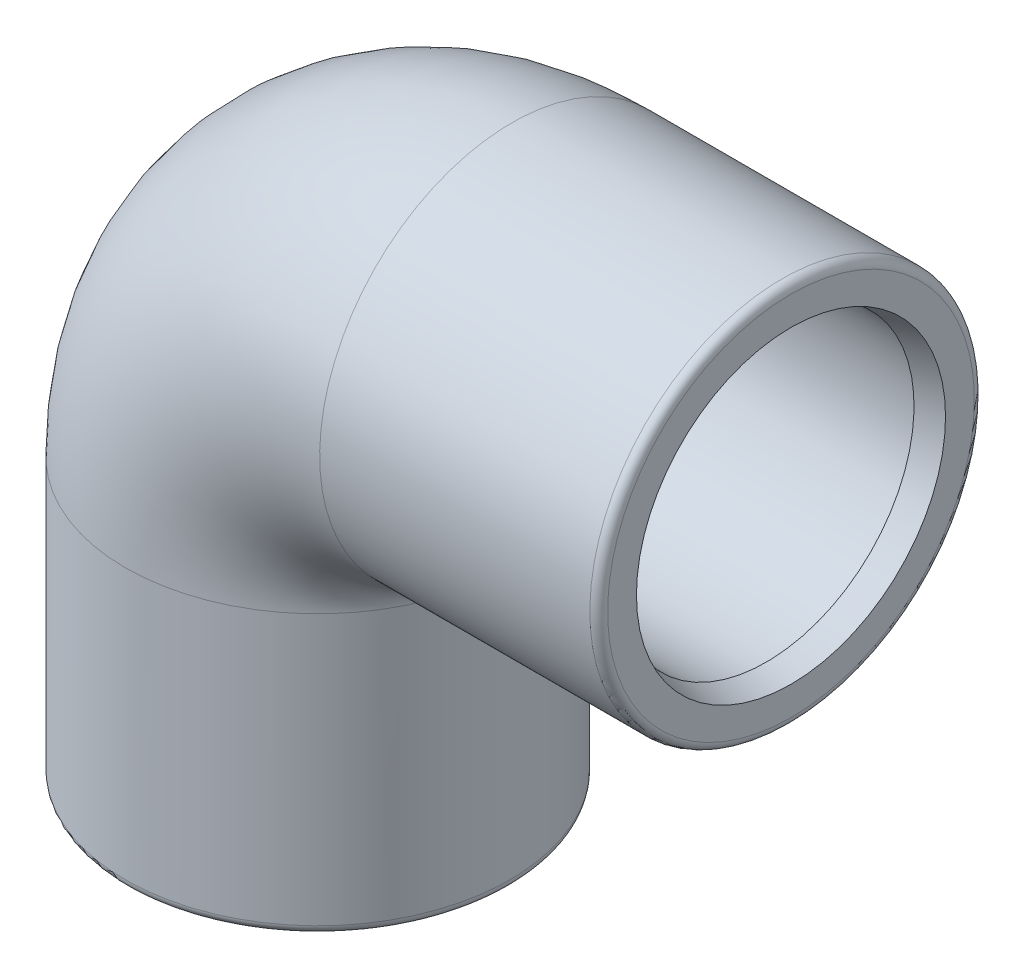
ISO-10303-21;
HEADER;
FILE_DESCRIPTION(('STEP AP214'),'2;1');
FILE_NAME('part.step','',(''),(''),'','','');
FILE_SCHEMA(('AUTOMOTIVE_DESIGN { 1 0 10303 214 1 1 1 1 }'));
ENDSEC;
DATA;
#1=APPLICATION_CONTEXT('core data for automotive mechanical design processes');
#2=APPLICATION_PROTOCOL_DEFINITION('international standard','automotive_design',2000,#1);
#3=PRODUCT_CONTEXT('',#1,'mechanical');
#4=PRODUCT('Part','Part','',(#3));
#5=PRODUCT_RELATED_PRODUCT_CATEGORY('part','',(#4));
#6=PRODUCT_DEFINITION_FORMATION('','',#4);
#7=PRODUCT_DEFINITION_CONTEXT('part definition',#1,'design');
#8=PRODUCT_DEFINITION('design','',#6,#7);
#9=PRODUCT_DEFINITION_SHAPE('','',#8);
#10=(LENGTH_UNIT() NAMED_UNIT(*) SI_UNIT(.MILLI.,.METRE.));
#11=(NAMED_UNIT(*) PLANE_ANGLE_UNIT() SI_UNIT($,.RADIAN.));
#12=(NAMED_UNIT(*) SI_UNIT($,.STERADIAN.) SOLID_ANGLE_UNIT());
#13=UNCERTAINTY_MEASURE_WITH_UNIT(LENGTH_MEASURE(1.E-05),#10,'distance_accuracy_value','');
#14=(GEOMETRIC_REPRESENTATION_CONTEXT(3) GLOBAL_UNCERTAINTY_ASSIGNED_CONTEXT((#13)) GLOBAL_UNIT_ASSIGNED_CONTEXT((#10,
#11,#12)) REPRESENTATION_CONTEXT('',''));
#15=CARTESIAN_POINT('',(0.,0.,0.));
#16=DIRECTION('',(0.,0.,1.));
#17=DIRECTION('',(1.,0.,0.));
#18=AXIS2_PLACEMENT_3D('',#15,#16,#17);
#19=CARTESIAN_POINT('',(0.,0.,0.));
#20=DIRECTION('',(0.,0.,-1.));
#21=DIRECTION('',(-1.,0.,0.));
#22=AXIS2_PLACEMENT_3D('',#19,#20,#21);
#23=TOROIDAL_SURFACE('',#22,13.13,13.);
#24=CARTESIAN_POINT('',(-13.13,0.,0.));
#25=DIRECTION('',(0.,1.,0.));
#26=DIRECTION('',(-1.,0.,0.));
#27=AXIS2_PLACEMENT_3D('',#24,#25,#26);
#28=CIRCLE('',#27,13.);
#29=CARTESIAN_POINT('',(-0.13,0.,0.));
#30=VERTEX_POINT('',#29);
#31=EDGE_CURVE('E79',#30,#30,#28,.T.);
#32=ORIENTED_EDGE('',*,*,#31,.T.);
#33=EDGE_LOOP('',(#32));
#34=FACE_BOUND('',#33,.T.);
#35=CARTESIAN_POINT('',(0.,13.13,0.));
#36=DIRECTION('',(-1.,0.,0.));
#37=DIRECTION('',(0.,1.,0.));
#38=AXIS2_PLACEMENT_3D('',#35,#36,#37);
#39=CIRCLE('',#38,13.);
#40=CARTESIAN_POINT('',(0.,0.13,0.));
#41=VERTEX_POINT('',#40);
#42=EDGE_CURVE('E11',#41,#41,#39,.T.);
#43=ORIENTED_EDGE('',*,*,#42,.T.);
#44=EDGE_LOOP('',(#43));
#45=FACE_BOUND('',#44,.T.);
#46=ADVANCED_FACE('F16',(#34,#45),#23,.T.);
#47=CARTESIAN_POINT('',(10.5,13.13,0.));
#48=DIRECTION('',(1.,0.,0.));
#49=DIRECTION('',(0.,0.,1.));
#50=AXIS2_PLACEMENT_3D('',#47,#48,#49);
#51=CYLINDRICAL_SURFACE('',#50,13.);
#52=ORIENTED_EDGE('',*,*,#42,.F.);
#53=EDGE_LOOP('',(#52));
#54=FACE_BOUND('',#53,.T.);
#55=CARTESIAN_POINT('',(18.27,13.13,0.));
#56=DIRECTION('',(-1.,0.,0.));
#57=DIRECTION('',(0.,0.,1.));
#58=AXIS2_PLACEMENT_3D('',#55,#56,#57);
#59=CIRCLE('',#58,13.);
#60=CARTESIAN_POINT('',(18.27,0.13,0.));
#61=VERTEX_POINT('',#60);
#62=EDGE_CURVE('E69',#61,#61,#59,.T.);
#63=ORIENTED_EDGE('',*,*,#62,.T.);
#64=EDGE_LOOP('',(#63));
#65=FACE_BOUND('',#64,.T.);
#66=ADVANCED_FACE('F107',(#54,#65),#51,.T.);
#67=CARTESIAN_POINT('',(0.,0.,0.));
#68=DIRECTION('',(0.,0.,-1.));
#69=DIRECTION('',(-1.,0.,0.));
#70=AXIS2_PLACEMENT_3D('',#67,#68,#69);
#71=TOROIDAL_SURFACE('',#70,13.13,9.);
#72=CARTESIAN_POINT('',(-13.13,0.,0.));
#73=DIRECTION('',(0.,1.,0.));
#74=DIRECTION('',(-1.,0.,0.));
#75=AXIS2_PLACEMENT_3D('',#72,#73,#74);
#76=CIRCLE('',#75,9.);
#77=CARTESIAN_POINT('',(-4.13,0.,0.));
#78=VERTEX_POINT('',#77);
#79=EDGE_CURVE('E87',#78,#78,#76,.T.);
#80=ORIENTED_EDGE('',*,*,#79,.F.);
#81=EDGE_LOOP('',(#80));
#82=FACE_BOUND('',#81,.T.);
#83=CARTESIAN_POINT('',(0.,13.13,0.));
#84=DIRECTION('',(-1.,0.,0.));
#85=DIRECTION('',(0.,1.,0.));
#86=AXIS2_PLACEMENT_3D('',#83,#84,#85);
#87=CIRCLE('',#86,9.);
#88=CARTESIAN_POINT('',(0.,4.13,0.));
#89=VERTEX_POINT('',#88);
#90=EDGE_CURVE('E26',#89,#89,#87,.T.);
#91=ORIENTED_EDGE('',*,*,#90,.F.);
#92=EDGE_LOOP('',(#91));
#93=FACE_BOUND('',#92,.T.);
#94=ADVANCED_FACE('F109',(#82,#93),#71,.F.);
#95=CARTESIAN_POINT('',(10.5,13.13,0.));
#96=DIRECTION('',(1.,0.,0.));
#97=DIRECTION('',(0.,0.,1.));
#98=AXIS2_PLACEMENT_3D('',#95,#96,#97);
#99=CYLINDRICAL_SURFACE('',#98,10.);
#100=CARTESIAN_POINT('',(0.,13.13,0.));
#101=DIRECTION('',(-1.,0.,0.));
#102=DIRECTION('',(0.,0.,1.));
#103=AXIS2_PLACEMENT_3D('',#100,#101,#102);
#104=CIRCLE('',#103,10.);
#105=CARTESIAN_POINT('',(0.,13.13,10.));
#106=VERTEX_POINT('',#105);
#107=EDGE_CURVE('E85',#106,#106,#104,.T.);
#108=ORIENTED_EDGE('',*,*,#107,.T.);
#109=EDGE_LOOP('',(#108));
#110=FACE_BOUND('',#109,.T.);
#111=CARTESIAN_POINT('',(17.190577136594,13.13,0.));
#112=DIRECTION('',(1.,0.,0.));
#113=DIRECTION('',(0.,0.,1.));
#114=AXIS2_PLACEMENT_3D('',#111,#112,#113);
#115=CIRCLE('',#114,10.);
#116=CARTESIAN_POINT('',(17.190577136594,23.13,0.));
#117=VERTEX_POINT('',#116);
#118=EDGE_CURVE('E73',#117,#117,#115,.T.);
#119=ORIENTED_EDGE('',*,*,#118,.T.);
#120=EDGE_LOOP('',(#119));
#121=FACE_BOUND('',#120,.T.);
#122=ADVANCED_FACE('F117',(#110,#121),#99,.F.);
#123=CARTESIAN_POINT('',(0.,13.13,0.));
#124=DIRECTION('',(-1.,0.,0.));
#125=DIRECTION('',(0.,0.,1.));
#126=AXIS2_PLACEMENT_3D('',#123,#124,#125);
#127=PLANE('',#126);
#128=ORIENTED_EDGE('',*,*,#90,.T.);
#129=EDGE_LOOP('',(#128));
#130=FACE_BOUND('',#129,.T.);
#131=ORIENTED_EDGE('',*,*,#107,.F.);
#132=EDGE_LOOP('',(#131));
#133=FACE_BOUND('',#132,.T.);
#134=ADVANCED_FACE('F152',(#130,#133),#127,.F.);
#135=CARTESIAN_POINT('',(-13.13,-10.5,0.));
#136=DIRECTION('',(0.,1.,0.));
#137=DIRECTION('',(0.,0.,1.));
#138=AXIS2_PLACEMENT_3D('',#135,#136,#137);
#139=CYLINDRICAL_SURFACE('',#138,10.);
#140=CARTESIAN_POINT('',(-13.13,0.,0.));
#141=DIRECTION('',(0.,1.,0.));
#142=DIRECTION('',(0.,0.,1.));
#143=AXIS2_PLACEMENT_3D('',#140,#141,#142);
#144=CIRCLE('',#143,10.);
#145=CARTESIAN_POINT('',(-13.13,0.,10.));
#146=VERTEX_POINT('',#145);
#147=EDGE_CURVE('E89',#146,#146,#144,.T.);
#148=ORIENTED_EDGE('',*,*,#147,.T.);
#149=EDGE_LOOP('',(#148));
#150=FACE_BOUND('',#149,.T.);
#151=CARTESIAN_POINT('',(-13.13,-17.190577136594,0.));
#152=DIRECTION('',(0.,-1.,0.));
#153=DIRECTION('',(0.,0.,1.));
#154=AXIS2_PLACEMENT_3D('',#151,#152,#153);
#155=CIRCLE('',#154,10.);
#156=CARTESIAN_POINT('',(-3.13,-17.190577136594,0.));
#157=VERTEX_POINT('',#156);
#158=EDGE_CURVE('E20',#157,#157,#155,.T.);
#159=ORIENTED_EDGE('',*,*,#158,.T.);
#160=EDGE_LOOP('',(#159));
#161=FACE_BOUND('',#160,.T.);
#162=ADVANCED_FACE('F18',(#150,#161),#139,.F.);
#163=CARTESIAN_POINT('',(-13.13,0.,0.));
#164=DIRECTION('',(0.,1.,0.));
#165=DIRECTION('',(0.,0.,-1.));
#166=AXIS2_PLACEMENT_3D('',#163,#164,#165);
#167=PLANE('',#166);
#168=ORIENTED_EDGE('',*,*,#79,.T.);
#169=EDGE_LOOP('',(#168));
#170=FACE_BOUND('',#169,.T.);
#171=ORIENTED_EDGE('',*,*,#147,.F.);
#172=EDGE_LOOP('',(#171));
#173=FACE_BOUND('',#172,.T.);
#174=ADVANCED_FACE('F130',(#170,#173),#167,.F.);
#175=CARTESIAN_POINT('',(18.87,13.13,0.));
#176=DIRECTION('',(-1.,0.,0.));
#177=DIRECTION('',(0.,0.,1.));
#178=AXIS2_PLACEMENT_3D('',#175,#176,#177);
#179=PLANE('',#178);
#180=CARTESIAN_POINT('',(18.87,13.13,0.));
#181=DIRECTION('',(1.,0.,0.));
#182=DIRECTION('',(0.,-1.,0.));
#183=AXIS2_PLACEMENT_3D('',#180,#181,#182);
#184=CIRCLE('',#183,12.4);
#185=CARTESIAN_POINT('',(18.87,0.73,0.));
#186=VERTEX_POINT('',#185);
#187=EDGE_CURVE('E71',#186,#186,#184,.T.);
#188=ORIENTED_EDGE('',*,*,#187,.T.);
#189=EDGE_LOOP('',(#188));
#190=FACE_BOUND('',#189,.T.);
#191=CARTESIAN_POINT('',(18.87,13.13,0.));
#192=DIRECTION('',(-1.,0.,0.));
#193=DIRECTION('',(0.,1.,0.));
#194=AXIS2_PLACEMENT_3D('',#191,#192,#193);
#195=CIRCLE('',#194,10.45);
#196=CARTESIAN_POINT('',(18.87,23.58,0.));
#197=VERTEX_POINT('',#196);
#198=EDGE_CURVE('E77',#197,#197,#195,.T.);
#199=ORIENTED_EDGE('',*,*,#198,.T.);
#200=EDGE_LOOP('',(#199));
#201=FACE_BOUND('',#200,.T.);
#202=ADVANCED_FACE('F96',(#190,#201),#179,.F.);
#203=CARTESIAN_POINT('',(-13.13,-18.87,0.));
#204=DIRECTION('',(0.,1.,0.));
#205=DIRECTION('',(0.,0.,1.));
#206=AXIS2_PLACEMENT_3D('',#203,#204,#205);
#207=PLANE('',#206);
#208=CARTESIAN_POINT('',(-13.13,-18.87,0.));
#209=DIRECTION('',(0.,-1.,0.));
#210=DIRECTION('',(-1.,0.,0.));
#211=AXIS2_PLACEMENT_3D('',#208,#209,#210);
#212=CIRCLE('',#211,12.4);
#213=CARTESIAN_POINT('',(-25.53,-18.87,0.));
#214=VERTEX_POINT('',#213);
#215=EDGE_CURVE('E82',#214,#214,#212,.T.);
#216=ORIENTED_EDGE('',*,*,#215,.T.);
#217=EDGE_LOOP('',(#216));
#218=FACE_BOUND('',#217,.T.);
#219=CARTESIAN_POINT('',(-13.13,-18.87,0.));
#220=DIRECTION('',(0.,1.,0.));
#221=DIRECTION('',(1.,0.,0.));
#222=AXIS2_PLACEMENT_3D('',#219,#220,#221);
#223=CIRCLE('',#222,10.45);
#224=CARTESIAN_POINT('',(-2.68,-18.87,0.));
#225=VERTEX_POINT('',#224);
#226=EDGE_CURVE('E70',#225,#225,#223,.T.);
#227=ORIENTED_EDGE('',*,*,#226,.T.);
#228=EDGE_LOOP('',(#227));
#229=FACE_BOUND('',#228,.T.);
#230=ADVANCED_FACE('F129',(#218,#229),#207,.F.);
#231=CARTESIAN_POINT('',(-13.13,-10.5,0.));
#232=DIRECTION('',(0.,1.,0.));
#233=DIRECTION('',(0.,0.,1.));
#234=AXIS2_PLACEMENT_3D('',#231,#232,#233);
#235=CYLINDRICAL_SURFACE('',#234,13.);
#236=CARTESIAN_POINT('',(-13.13,-18.27,0.));
#237=DIRECTION('',(0.,-1.,0.));
#238=DIRECTION('',(0.,0.,1.));
#239=AXIS2_PLACEMENT_3D('',#236,#237,#238);
#240=CIRCLE('',#239,13.);
#241=CARTESIAN_POINT('',(-26.13,-18.27,0.));
#242=VERTEX_POINT('',#241);
#243=EDGE_CURVE('E81',#242,#242,#240,.T.);
#244=ORIENTED_EDGE('',*,*,#243,.F.);
#245=EDGE_LOOP('',(#244));
#246=FACE_BOUND('',#245,.T.);
#247=ORIENTED_EDGE('',*,*,#31,.F.);
#248=EDGE_LOOP('',(#247));
#249=FACE_BOUND('',#248,.T.);
#250=ADVANCED_FACE('F131',(#246,#249),#235,.T.);
#251=CARTESIAN_POINT('',(-13.13,-18.27,0.));
#252=DIRECTION('',(0.,-1.,0.));
#253=DIRECTION('',(0.,0.,1.));
#254=AXIS2_PLACEMENT_3D('',#251,#252,#253);
#255=TOROIDAL_SURFACE('',#254,12.4,0.6);
#256=ORIENTED_EDGE('',*,*,#215,.F.);
#257=EDGE_LOOP('',(#256));
#258=FACE_BOUND('',#257,.T.);
#259=ORIENTED_EDGE('',*,*,#243,.T.);
#260=EDGE_LOOP('',(#259));
#261=FACE_BOUND('',#260,.T.);
#262=ADVANCED_FACE('F103',(#258,#261),#255,.T.);
#263=CARTESIAN_POINT('',(18.27,13.13,0.));
#264=DIRECTION('',(1.,0.,0.));
#265=DIRECTION('',(0.,0.,1.));
#266=AXIS2_PLACEMENT_3D('',#263,#264,#265);
#267=TOROIDAL_SURFACE('',#266,12.4,0.6);
#268=ORIENTED_EDGE('',*,*,#187,.F.);
#269=EDGE_LOOP('',(#268));
#270=FACE_BOUND('',#269,.T.);
#271=ORIENTED_EDGE('',*,*,#62,.F.);
#272=EDGE_LOOP('',(#271));
#273=FACE_BOUND('',#272,.T.);
#274=ADVANCED_FACE('F99',(#270,#273),#267,.T.);
#275=CARTESIAN_POINT('',(-13.13,-18.030288568297,0.));
#276=DIRECTION('',(0.,-1.,0.));
#277=DIRECTION('',(1.,0.,0.));
#278=AXIS2_PLACEMENT_3D('',#275,#276,#277);
#279=CONICAL_SURFACE('',#278,10.225,0.261799387799149);
#280=ORIENTED_EDGE('',*,*,#158,.F.);
#281=EDGE_LOOP('',(#280));
#282=FACE_BOUND('',#281,.T.);
#283=ORIENTED_EDGE('',*,*,#226,.F.);
#284=EDGE_LOOP('',(#283));
#285=FACE_BOUND('',#284,.T.);
#286=ADVANCED_FACE('F102',(#282,#285),#279,.F.);
#287=CARTESIAN_POINT('',(18.030288568297,13.13,0.));
#288=DIRECTION('',(1.,0.,0.));
#289=DIRECTION('',(0.,1.,0.));
#290=AXIS2_PLACEMENT_3D('',#287,#288,#289);
#291=CONICAL_SURFACE('',#290,10.225,0.261799387799149);
#292=ORIENTED_EDGE('',*,*,#118,.F.);
#293=EDGE_LOOP('',(#292));
#294=FACE_BOUND('',#293,.T.);
#295=ORIENTED_EDGE('',*,*,#198,.F.);
#296=EDGE_LOOP('',(#295));
#297=FACE_BOUND('',#296,.T.);
#298=ADVANCED_FACE('F127',(#294,#297),#291,.F.);
#299=CLOSED_SHELL('',(#46,#66,#94,#122,#134,#162,#174,#202,#230,#250,#262,#274,#286,#298));
#300=MANIFOLD_SOLID_BREP('B1',#299);
#301=ADVANCED_BREP_SHAPE_REPRESENTATION('',(#18,#300),#14);
#302=SHAPE_DEFINITION_REPRESENTATION(#9,#301);
ENDSEC;
END-ISO-10303-21;
